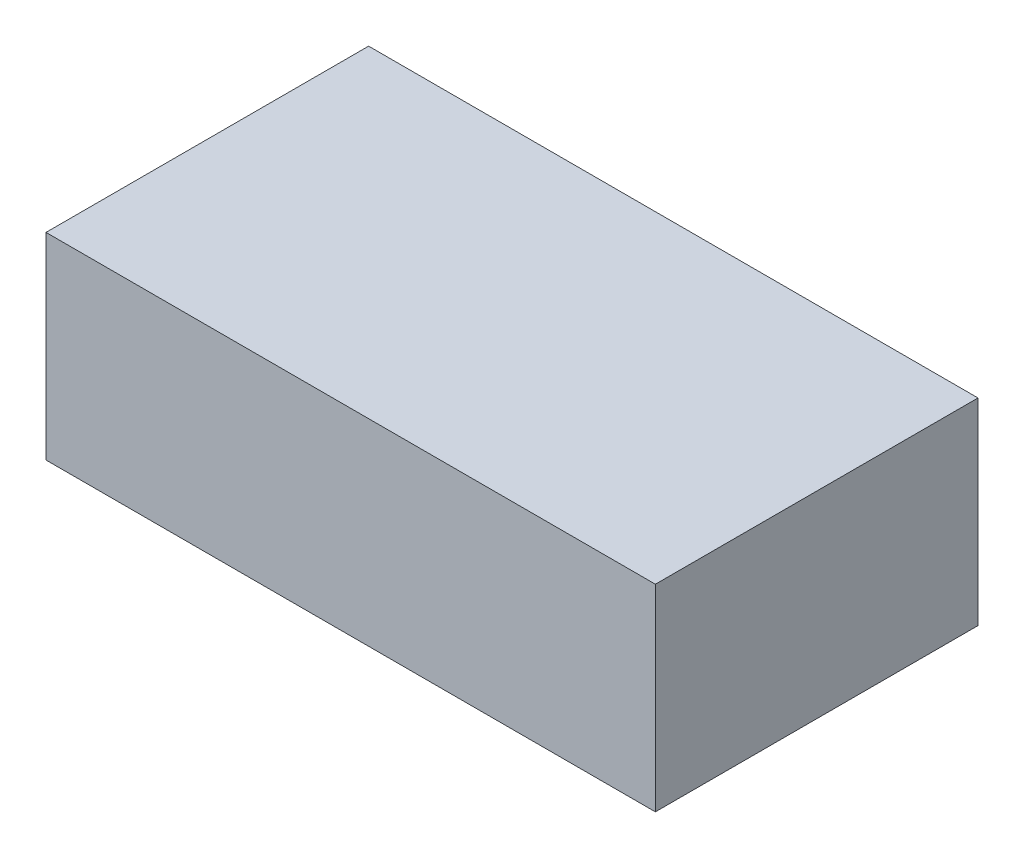
ISO-10303-21;
HEADER;
FILE_DESCRIPTION(('STEP AP214'),'2;1');
FILE_NAME('part.step','',(''),(''),'','','');
FILE_SCHEMA(('AUTOMOTIVE_DESIGN { 1 0 10303 214 1 1 1 1 }'));
ENDSEC;
DATA;
#1=APPLICATION_CONTEXT('core data for automotive mechanical design processes');
#2=APPLICATION_PROTOCOL_DEFINITION('international standard','automotive_design',2000,#1);
#3=PRODUCT_CONTEXT('',#1,'mechanical');
#4=PRODUCT('Part','Part','',(#3));
#5=PRODUCT_RELATED_PRODUCT_CATEGORY('part','',(#4));
#6=PRODUCT_DEFINITION_FORMATION('','',#4);
#7=PRODUCT_DEFINITION_CONTEXT('part definition',#1,'design');
#8=PRODUCT_DEFINITION('design','',#6,#7);
#9=PRODUCT_DEFINITION_SHAPE('','',#8);
#10=(LENGTH_UNIT() NAMED_UNIT(*) SI_UNIT(.MILLI.,.METRE.));
#11=(NAMED_UNIT(*) PLANE_ANGLE_UNIT() SI_UNIT($,.RADIAN.));
#12=(NAMED_UNIT(*) SI_UNIT($,.STERADIAN.) SOLID_ANGLE_UNIT());
#13=UNCERTAINTY_MEASURE_WITH_UNIT(LENGTH_MEASURE(1.E-05),#10,'distance_accuracy_value','');
#14=(GEOMETRIC_REPRESENTATION_CONTEXT(3) GLOBAL_UNCERTAINTY_ASSIGNED_CONTEXT((#13)) GLOBAL_UNIT_ASSIGNED_CONTEXT((#10,
#11,#12)) REPRESENTATION_CONTEXT('',''));
#15=CARTESIAN_POINT('',(0.,0.,0.));
#16=DIRECTION('',(0.,0.,1.));
#17=DIRECTION('',(1.,0.,0.));
#18=AXIS2_PLACEMENT_3D('',#15,#16,#17);
#19=CARTESIAN_POINT('',(3.,23.,-23.));
#20=DIRECTION('',(1.,0.,0.));
#21=DIRECTION('',(0.,0.,-1.));
#22=AXIS2_PLACEMENT_3D('',#19,#20,#21);
#23=PLANE('',#22);
#24=DIRECTION('',(0.,0.,1.));
#25=VECTOR('',#24,1.);
#26=CARTESIAN_POINT('',(3.,12.,-23.));
#27=LINE('',#26,#25);
#28=CARTESIAN_POINT('',(3.,12.,-23.));
#29=VERTEX_POINT('',#28);
#30=CARTESIAN_POINT('',(3.,12.,-5.));
#31=VERTEX_POINT('',#30);
#32=EDGE_CURVE('E104',#29,#31,#27,.T.);
#33=ORIENTED_EDGE('',*,*,#32,.T.);
#34=DIRECTION('',(0.,-1.,0.));
#35=VECTOR('',#34,1.);
#36=CARTESIAN_POINT('',(3.,23.,-5.));
#37=LINE('',#36,#35);
#38=CARTESIAN_POINT('',(3.,23.,-5.));
#39=VERTEX_POINT('',#38);
#40=EDGE_CURVE('E11',#39,#31,#37,.T.);
#41=ORIENTED_EDGE('',*,*,#40,.F.);
#42=DIRECTION('',(0.,0.,1.));
#43=VECTOR('',#42,1.);
#44=CARTESIAN_POINT('',(3.,23.,-23.));
#45=LINE('',#44,#43);
#46=CARTESIAN_POINT('',(3.,23.,-23.));
#47=VERTEX_POINT('',#46);
#48=EDGE_CURVE('E92',#47,#39,#45,.T.);
#49=ORIENTED_EDGE('',*,*,#48,.F.);
#50=DIRECTION('',(0.,-1.,0.));
#51=VECTOR('',#50,1.);
#52=CARTESIAN_POINT('',(3.,23.,-23.));
#53=LINE('',#52,#51);
#54=EDGE_CURVE('E100',#47,#29,#53,.T.);
#55=ORIENTED_EDGE('',*,*,#54,.T.);
#56=EDGE_LOOP('',(#33,#41,#49,#55));
#57=FACE_BOUND('',#56,.T.);
#58=ADVANCED_FACE('F41',(#57),#23,.F.);
#59=CARTESIAN_POINT('',(3.,23.,-5.));
#60=DIRECTION('',(0.,0.,-1.));
#61=DIRECTION('',(-1.,0.,0.));
#62=AXIS2_PLACEMENT_3D('',#59,#60,#61);
#63=PLANE('',#62);
#64=DIRECTION('',(1.,0.,0.));
#65=VECTOR('',#64,1.);
#66=CARTESIAN_POINT('',(3.,12.,-5.));
#67=LINE('',#66,#65);
#68=CARTESIAN_POINT('',(37.,12.,-5.));
#69=VERTEX_POINT('',#68);
#70=EDGE_CURVE('E96',#31,#69,#67,.T.);
#71=ORIENTED_EDGE('',*,*,#70,.T.);
#72=DIRECTION('',(0.,-1.,0.));
#73=VECTOR('',#72,1.);
#74=CARTESIAN_POINT('',(37.,23.,-5.));
#75=LINE('',#74,#73);
#76=CARTESIAN_POINT('',(37.,23.,-5.));
#77=VERTEX_POINT('',#76);
#78=EDGE_CURVE('E49',#77,#69,#75,.T.);
#79=ORIENTED_EDGE('',*,*,#78,.F.);
#80=DIRECTION('',(1.,0.,0.));
#81=VECTOR('',#80,1.);
#82=CARTESIAN_POINT('',(3.,23.,-5.));
#83=LINE('',#82,#81);
#84=EDGE_CURVE('E87',#39,#77,#83,.T.);
#85=ORIENTED_EDGE('',*,*,#84,.F.);
#86=ORIENTED_EDGE('',*,*,#40,.T.);
#87=EDGE_LOOP('',(#71,#79,#85,#86));
#88=FACE_BOUND('',#87,.T.);
#89=ADVANCED_FACE('F95',(#88),#63,.F.);
#90=CARTESIAN_POINT('',(37.,23.,-5.));
#91=DIRECTION('',(-1.,0.,0.));
#92=DIRECTION('',(0.,0.,1.));
#93=AXIS2_PLACEMENT_3D('',#90,#91,#92);
#94=PLANE('',#93);
#95=DIRECTION('',(0.,0.,-1.));
#96=VECTOR('',#95,1.);
#97=CARTESIAN_POINT('',(37.,12.,-5.));
#98=LINE('',#97,#96);
#99=CARTESIAN_POINT('',(37.,12.,-23.));
#100=VERTEX_POINT('',#99);
#101=EDGE_CURVE('E74',#69,#100,#98,.T.);
#102=ORIENTED_EDGE('',*,*,#101,.T.);
#103=DIRECTION('',(0.,-1.,0.));
#104=VECTOR('',#103,1.);
#105=CARTESIAN_POINT('',(37.,23.,-23.));
#106=LINE('',#105,#104);
#107=CARTESIAN_POINT('',(37.,23.,-23.));
#108=VERTEX_POINT('',#107);
#109=EDGE_CURVE('E97',#108,#100,#106,.T.);
#110=ORIENTED_EDGE('',*,*,#109,.F.);
#111=DIRECTION('',(0.,0.,-1.));
#112=VECTOR('',#111,1.);
#113=CARTESIAN_POINT('',(37.,23.,-5.));
#114=LINE('',#113,#112);
#115=EDGE_CURVE('E90',#77,#108,#114,.T.);
#116=ORIENTED_EDGE('',*,*,#115,.F.);
#117=ORIENTED_EDGE('',*,*,#78,.T.);
#118=EDGE_LOOP('',(#102,#110,#116,#117));
#119=FACE_BOUND('',#118,.T.);
#120=ADVANCED_FACE('F98',(#119),#94,.F.);
#121=CARTESIAN_POINT('',(37.,23.,-23.));
#122=DIRECTION('',(0.,0.,1.));
#123=DIRECTION('',(1.,0.,0.));
#124=AXIS2_PLACEMENT_3D('',#121,#122,#123);
#125=PLANE('',#124);
#126=DIRECTION('',(-1.,0.,0.));
#127=VECTOR('',#126,1.);
#128=CARTESIAN_POINT('',(37.,12.,-23.));
#129=LINE('',#128,#127);
#130=EDGE_CURVE('E80',#100,#29,#129,.T.);
#131=ORIENTED_EDGE('',*,*,#130,.T.);
#132=ORIENTED_EDGE('',*,*,#54,.F.);
#133=DIRECTION('',(-1.,0.,0.));
#134=VECTOR('',#133,1.);
#135=CARTESIAN_POINT('',(37.,23.,-23.));
#136=LINE('',#135,#134);
#137=EDGE_CURVE('E57',#108,#47,#136,.T.);
#138=ORIENTED_EDGE('',*,*,#137,.F.);
#139=ORIENTED_EDGE('',*,*,#109,.T.);
#140=EDGE_LOOP('',(#131,#132,#138,#139));
#141=FACE_BOUND('',#140,.T.);
#142=ADVANCED_FACE('F111',(#141),#125,.F.);
#143=CARTESIAN_POINT('',(0.,23.,0.));
#144=DIRECTION('',(0.,1.,0.));
#145=DIRECTION('',(0.,0.,1.));
#146=AXIS2_PLACEMENT_3D('',#143,#144,#145);
#147=PLANE('',#146);
#148=ORIENTED_EDGE('',*,*,#48,.T.);
#149=ORIENTED_EDGE('',*,*,#84,.T.);
#150=ORIENTED_EDGE('',*,*,#115,.T.);
#151=ORIENTED_EDGE('',*,*,#137,.T.);
#152=EDGE_LOOP('',(#148,#149,#150,#151));
#153=FACE_BOUND('',#152,.T.);
#154=ADVANCED_FACE('F88',(#153),#147,.T.);
#155=CARTESIAN_POINT('',(0.,12.,0.));
#156=DIRECTION('',(0.,1.,0.));
#157=DIRECTION('',(0.,0.,1.));
#158=AXIS2_PLACEMENT_3D('',#155,#156,#157);
#159=PLANE('',#158);
#160=ORIENTED_EDGE('',*,*,#32,.F.);
#161=ORIENTED_EDGE('',*,*,#130,.F.);
#162=ORIENTED_EDGE('',*,*,#101,.F.);
#163=ORIENTED_EDGE('',*,*,#70,.F.);
#164=EDGE_LOOP('',(#160,#161,#162,#163));
#165=FACE_BOUND('',#164,.T.);
#166=ADVANCED_FACE('F114',(#165),#159,.F.);
#167=CLOSED_SHELL('',(#58,#89,#120,#142,#154,#166));
#168=MANIFOLD_SOLID_BREP('B2',#167);
#169=ADVANCED_BREP_SHAPE_REPRESENTATION('',(#18,#168),#14);
#170=SHAPE_DEFINITION_REPRESENTATION(#9,#169);
ENDSEC;
END-ISO-10303-21;
